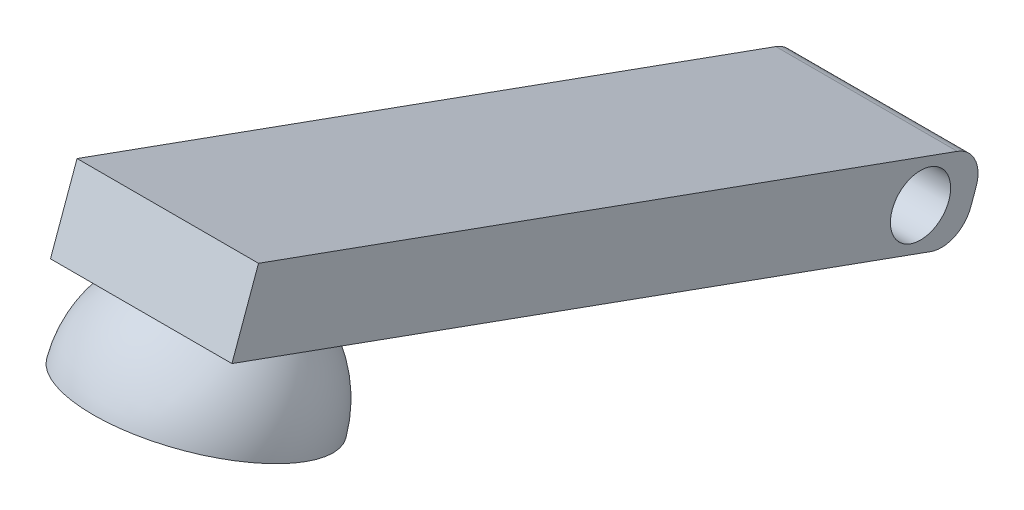
ISO-10303-21;
HEADER;
FILE_DESCRIPTION(('STEP AP214'),'2;1');
FILE_NAME('part.step','',(''),(''),'','','');
FILE_SCHEMA(('AUTOMOTIVE_DESIGN { 1 0 10303 214 1 1 1 1 }'));
ENDSEC;
DATA;
#1=APPLICATION_CONTEXT('core data for automotive mechanical design processes');
#2=APPLICATION_PROTOCOL_DEFINITION('international standard','automotive_design',2000,#1);
#3=PRODUCT_CONTEXT('',#1,'mechanical');
#4=PRODUCT('Part','Part','',(#3));
#5=PRODUCT_RELATED_PRODUCT_CATEGORY('part','',(#4));
#6=PRODUCT_DEFINITION_FORMATION('','',#4);
#7=PRODUCT_DEFINITION_CONTEXT('part definition',#1,'design');
#8=PRODUCT_DEFINITION('design','',#6,#7);
#9=PRODUCT_DEFINITION_SHAPE('','',#8);
#10=(LENGTH_UNIT() NAMED_UNIT(*) SI_UNIT(.MILLI.,.METRE.));
#11=(NAMED_UNIT(*) PLANE_ANGLE_UNIT() SI_UNIT($,.RADIAN.));
#12=(NAMED_UNIT(*) SI_UNIT($,.STERADIAN.) SOLID_ANGLE_UNIT());
#13=UNCERTAINTY_MEASURE_WITH_UNIT(LENGTH_MEASURE(1.E-05),#10,'distance_accuracy_value','');
#14=(GEOMETRIC_REPRESENTATION_CONTEXT(3) GLOBAL_UNCERTAINTY_ASSIGNED_CONTEXT((#13)) GLOBAL_UNIT_ASSIGNED_CONTEXT((#10,
#11,#12)) REPRESENTATION_CONTEXT('',''));
#15=CARTESIAN_POINT('',(0.,0.,0.));
#16=DIRECTION('',(0.,0.,1.));
#17=DIRECTION('',(1.,0.,0.));
#18=AXIS2_PLACEMENT_3D('',#15,#16,#17);
#19=CARTESIAN_POINT('',(-74.7211519900755,7.99266774800508,22.125696733824));
#20=DIRECTION('',(0.,-0.339750987389327,-0.940515426012767));
#21=DIRECTION('',(0.,0.940515426012767,-0.339750987389327));
#22=AXIS2_PLACEMENT_3D('',#19,#20,#21);
#23=PLANE('',#22);
#24=DIRECTION('',(0.,0.940515426012767,-0.339750987389327));
#25=VECTOR('',#24,1.);
#26=CARTESIAN_POINT('',(-7.366,7.99266774800508,22.125696733824));
#27=LINE('',#26,#25);
#28=CARTESIAN_POINT('',(-7.366,49.8389678302955,7.00917511352338));
#29=VERTEX_POINT('',#28);
#30=CARTESIAN_POINT('',(-7.366,55.8112407854766,4.85175634360115));
#31=VERTEX_POINT('',#30);
#32=EDGE_CURVE('E130',#29,#31,#27,.T.);
#33=ORIENTED_EDGE('',*,*,#32,.F.);
#34=DIRECTION('',(1.,0.,0.));
#35=VECTOR('',#34,1.);
#36=CARTESIAN_POINT('',(-74.7211519900755,49.8389678302955,7.00917511352338));
#37=LINE('',#36,#35);
#38=CARTESIAN_POINT('',(7.366,49.8389678302955,7.00917511352338));
#39=VERTEX_POINT('',#38);
#40=EDGE_CURVE('E100',#29,#39,#37,.T.);
#41=ORIENTED_EDGE('',*,*,#40,.T.);
#42=DIRECTION('',(0.,0.940515426012767,-0.339750987389327));
#43=VECTOR('',#42,1.);
#44=CARTESIAN_POINT('',(7.366,7.99266774800508,22.125696733824));
#45=LINE('',#44,#43);
#46=CARTESIAN_POINT('',(7.366,55.8112407854766,4.85175634360115));
#47=VERTEX_POINT('',#46);
#48=EDGE_CURVE('E104',#39,#47,#45,.T.);
#49=ORIENTED_EDGE('',*,*,#48,.T.);
#50=DIRECTION('',(1.,0.,0.));
#51=VECTOR('',#50,1.);
#52=CARTESIAN_POINT('',(-74.7211519900755,55.8112407854766,4.85175634360115));
#53=LINE('',#52,#51);
#54=EDGE_CURVE('E119',#31,#47,#53,.T.);
#55=ORIENTED_EDGE('',*,*,#54,.F.);
#56=EDGE_LOOP('',(#33,#41,#49,#55));
#57=FACE_BOUND('',#56,.T.);
#58=ADVANCED_FACE('F35',(#57),#23,.F.);
#59=CARTESIAN_POINT('',(-74.7211519900755,47.8185730374715,-17.2739403902229));
#60=DIRECTION('',(0.,-0.940515426012767,0.339750987389328));
#61=DIRECTION('',(0.,-0.339750987389328,-0.940515426012767));
#62=AXIS2_PLACEMENT_3D('',#59,#60,#61);
#63=PLANE('',#62);
#64=DIRECTION('',(0.,-0.339750987389328,-0.940515426012767));
#65=VECTOR('',#64,1.);
#66=CARTESIAN_POINT('',(7.366,47.8185730374715,-17.2739403902229));
#67=LINE('',#66,#65);
#68=CARTESIAN_POINT('',(7.366,35.3157624712154,-51.884836730619));
#69=VERTEX_POINT('',#68);
#70=EDGE_CURVE('E117',#47,#69,#67,.T.);
#71=ORIENTED_EDGE('',*,*,#70,.T.);
#72=DIRECTION('',(1.,0.,0.));
#73=VECTOR('',#72,1.);
#74=CARTESIAN_POINT('',(-74.7211519900755,35.3157624712154,-51.884836730619));
#75=LINE('',#74,#73);
#76=CARTESIAN_POINT('',(-7.366,35.3157624712154,-51.8848367306191));
#77=VERTEX_POINT('',#76);
#78=EDGE_CURVE('E11',#69,#77,#75,.F.);
#79=ORIENTED_EDGE('',*,*,#78,.T.);
#80=DIRECTION('',(0.,-0.339750987389328,-0.940515426012767));
#81=VECTOR('',#80,1.);
#82=CARTESIAN_POINT('',(-7.366,47.8185730374715,-17.2739403902229));
#83=LINE('',#82,#81);
#84=EDGE_CURVE('E128',#31,#77,#83,.T.);
#85=ORIENTED_EDGE('',*,*,#84,.F.);
#86=ORIENTED_EDGE('',*,*,#54,.T.);
#87=EDGE_LOOP('',(#71,#79,#85,#86));
#88=FACE_BOUND('',#87,.T.);
#89=ADVANCED_FACE('F171',(#88),#63,.F.);
#90=CARTESIAN_POINT('',(-74.7211519900755,-13.365778074225,-36.9998055224686));
#91=DIRECTION('',(0.,0.339750987389328,0.940515426012767));
#92=DIRECTION('',(0.,-0.940515426012767,0.339750987389328));
#93=AXIS2_PLACEMENT_3D('',#90,#91,#92);
#94=PLANE('',#93);
#95=DIRECTION('',(0.,-0.940515426012767,0.339750987389328));
#96=VECTOR('',#95,1.);
#97=CARTESIAN_POINT('',(7.366,-13.365778074225,-36.9998055224686));
#98=LINE('',#97,#96);
#99=CARTESIAN_POINT('',(7.366,32.0638857811741,-53.4107784047226));
#100=VERTEX_POINT('',#99);
#101=CARTESIAN_POINT('',(7.366,30.869431190138,-52.9792946507382));
#102=VERTEX_POINT('',#101);
#103=EDGE_CURVE('E115',#100,#102,#98,.T.);
#104=ORIENTED_EDGE('',*,*,#103,.T.);
#105=DIRECTION('',(1.,0.,0.));
#106=VECTOR('',#105,1.);
#107=CARTESIAN_POINT('',(-74.7211519900755,30.869431190138,-52.9792946507382));
#108=LINE('',#107,#106);
#109=CARTESIAN_POINT('',(-7.366,30.869431190138,-52.9792946507382));
#110=VERTEX_POINT('',#109);
#111=EDGE_CURVE('E56',#102,#110,#108,.F.);
#112=ORIENTED_EDGE('',*,*,#111,.T.);
#113=DIRECTION('',(0.,-0.940515426012767,0.339750987389328));
#114=VECTOR('',#113,1.);
#115=CARTESIAN_POINT('',(-7.366,-13.365778074225,-36.9998055224686));
#116=LINE('',#115,#114);
#117=CARTESIAN_POINT('',(-7.366,32.063885781174,-53.4107784047226));
#118=VERTEX_POINT('',#117);
#119=EDGE_CURVE('E125',#118,#110,#116,.T.);
#120=ORIENTED_EDGE('',*,*,#119,.F.);
#121=DIRECTION('',(1.,0.,0.));
#122=VECTOR('',#121,1.);
#123=CARTESIAN_POINT('',(-74.7211519900755,32.063885781174,-53.4107784047226));
#124=LINE('',#123,#122);
#125=EDGE_CURVE('E144',#118,#100,#124,.T.);
#126=ORIENTED_EDGE('',*,*,#125,.T.);
#127=EDGE_LOOP('',(#104,#112,#120,#126));
#128=FACE_BOUND('',#127,.T.);
#129=ADVANCED_FACE('F166',(#128),#94,.F.);
#130=CARTESIAN_POINT('',(-74.7211519900755,41.8463000822905,-15.1165216203006));
#131=DIRECTION('',(0.,0.940515426012768,-0.339750987389326));
#132=DIRECTION('',(0.,0.339750987389326,0.940515426012768));
#133=AXIS2_PLACEMENT_3D('',#130,#131,#132);
#134=PLANE('',#133);
#135=CARTESIAN_POINT('',(0.,47.4451827283613,0.382581230077784));
#136=DIRECTION('',(0.,0.940515426012768,-0.339750987389326));
#137=DIRECTION('',(0.,0.339750987389326,0.940515426012768));
#138=AXIS2_PLACEMENT_3D('',#135,#136,#137);
#139=CIRCLE('',#138,6.22170394666915);
#140=CARTESIAN_POINT('',(0.,49.5590127874862,6.23418976800463));
#141=VERTEX_POINT('',#140);
#142=EDGE_CURVE('E127',#141,#141,#139,.F.);
#143=ORIENTED_EDGE('',*,*,#142,.F.);
#144=EDGE_LOOP('',(#143));
#145=FACE_BOUND('',#144,.T.);
#146=DIRECTION('',(0.,0.339750987389326,0.940515426012768));
#147=VECTOR('',#146,1.);
#148=CARTESIAN_POINT('',(-7.366,41.8463000822905,-15.1165216203006));
#149=LINE('',#148,#147);
#150=CARTESIAN_POINT('',(-7.366,29.3434895160344,-49.7274179606969));
#151=VERTEX_POINT('',#150);
#152=EDGE_CURVE('E124',#151,#29,#149,.T.);
#153=ORIENTED_EDGE('',*,*,#152,.F.);
#154=DIRECTION('',(1.,0.,0.));
#155=VECTOR('',#154,1.);
#156=CARTESIAN_POINT('',(-74.7211519900755,29.3434895160344,-49.7274179606969));
#157=LINE('',#156,#155);
#158=CARTESIAN_POINT('',(7.366,29.3434895160344,-49.7274179606969));
#159=VERTEX_POINT('',#158);
#160=EDGE_CURVE('E137',#151,#159,#157,.T.);
#161=ORIENTED_EDGE('',*,*,#160,.T.);
#162=DIRECTION('',(0.,0.339750987389326,0.940515426012768));
#163=VECTOR('',#162,1.);
#164=CARTESIAN_POINT('',(7.366,41.8463000822905,-15.1165216203006));
#165=LINE('',#164,#163);
#166=EDGE_CURVE('E113',#159,#39,#165,.T.);
#167=ORIENTED_EDGE('',*,*,#166,.T.);
#168=ORIENTED_EDGE('',*,*,#40,.F.);
#169=EDGE_LOOP('',(#153,#161,#167,#168));
#170=FACE_BOUND('',#169,.T.);
#171=ADVANCED_FACE('F157',(#145,#170),#134,.F.);
#172=CARTESIAN_POINT('',(-74.7211519900755,33.02,-48.895));
#173=DIRECTION('',(1.,0.,0.));
#174=DIRECTION('',(0.,0.,-1.));
#175=AXIS2_PLACEMENT_3D('',#172,#173,#174);
#176=CYLINDRICAL_SURFACE('',#175,2.44475000000001);
#177=CARTESIAN_POINT('',(7.366,33.02,-48.895));
#178=DIRECTION('',(-1.,0.,0.));
#179=DIRECTION('',(0.,0.,1.));
#180=AXIS2_PLACEMENT_3D('',#177,#178,#179);
#181=CIRCLE('',#180,2.44475000000001);
#182=CARTESIAN_POINT('',(7.366,33.02,-46.45025));
#183=VERTEX_POINT('',#182);
#184=EDGE_CURVE('E109',#183,#183,#181,.F.);
#185=ORIENTED_EDGE('',*,*,#184,.T.);
#186=EDGE_LOOP('',(#185));
#187=FACE_BOUND('',#186,.T.);
#188=CARTESIAN_POINT('',(-7.366,33.02,-48.895));
#189=DIRECTION('',(-1.,0.,0.));
#190=DIRECTION('',(0.,0.,1.));
#191=AXIS2_PLACEMENT_3D('',#188,#189,#190);
#192=CIRCLE('',#191,2.44475000000001);
#193=CARTESIAN_POINT('',(-7.366,33.02,-46.45025));
#194=VERTEX_POINT('',#193);
#195=EDGE_CURVE('E112',#194,#194,#192,.F.);
#196=ORIENTED_EDGE('',*,*,#195,.F.);
#197=EDGE_LOOP('',(#196));
#198=FACE_BOUND('',#197,.T.);
#199=ADVANCED_FACE('F182',(#187,#198),#176,.F.);
#200=CARTESIAN_POINT('',(7.366,0.,0.));
#201=DIRECTION('',(-1.,0.,0.));
#202=DIRECTION('',(0.,0.,1.));
#203=AXIS2_PLACEMENT_3D('',#200,#201,#202);
#204=PLANE('',#203);
#205=ORIENTED_EDGE('',*,*,#166,.F.);
#206=CARTESIAN_POINT('',(7.366,31.7323986981068,-50.5903854686657));
#207=DIRECTION('',(-1.,0.,0.));
#208=DIRECTION('',(0.,0.,1.));
#209=AXIS2_PLACEMENT_3D('',#206,#207,#208);
#210=CIRCLE('',#209,2.54);
#211=EDGE_CURVE('E142',#159,#102,#210,.F.);
#212=ORIENTED_EDGE('',*,*,#211,.T.);
#213=ORIENTED_EDGE('',*,*,#103,.F.);
#214=CARTESIAN_POINT('',(7.366,32.9268532891429,-51.0218692226501));
#215=DIRECTION('',(-1.,0.,0.));
#216=DIRECTION('',(0.,0.,1.));
#217=AXIS2_PLACEMENT_3D('',#214,#215,#216);
#218=CIRCLE('',#217,2.54);
#219=EDGE_CURVE('E140',#100,#69,#218,.F.);
#220=ORIENTED_EDGE('',*,*,#219,.T.);
#221=ORIENTED_EDGE('',*,*,#70,.F.);
#222=ORIENTED_EDGE('',*,*,#48,.F.);
#223=EDGE_LOOP('',(#205,#212,#213,#220,#221,#222));
#224=FACE_BOUND('',#223,.T.);
#225=ORIENTED_EDGE('',*,*,#184,.F.);
#226=EDGE_LOOP('',(#225));
#227=FACE_BOUND('',#226,.T.);
#228=ADVANCED_FACE('F163',(#224,#227),#204,.F.);
#229=CARTESIAN_POINT('',(-7.366,25.4,-49.53));
#230=DIRECTION('',(-1.,0.,0.));
#231=DIRECTION('',(0.,0.,1.));
#232=AXIS2_PLACEMENT_3D('',#229,#230,#231);
#233=PLANE('',#232);
#234=ORIENTED_EDGE('',*,*,#195,.T.);
#235=EDGE_LOOP('',(#234));
#236=FACE_BOUND('',#235,.T.);
#237=ORIENTED_EDGE('',*,*,#119,.T.);
#238=CARTESIAN_POINT('',(-7.366,31.7323986981068,-50.5903854686657));
#239=DIRECTION('',(-1.,0.,0.));
#240=DIRECTION('',(0.,0.,1.));
#241=AXIS2_PLACEMENT_3D('',#238,#239,#240);
#242=CIRCLE('',#241,2.54);
#243=EDGE_CURVE('E43',#110,#151,#242,.T.);
#244=ORIENTED_EDGE('',*,*,#243,.T.);
#245=ORIENTED_EDGE('',*,*,#152,.T.);
#246=ORIENTED_EDGE('',*,*,#32,.T.);
#247=ORIENTED_EDGE('',*,*,#84,.T.);
#248=CARTESIAN_POINT('',(-7.366,32.9268532891429,-51.0218692226501));
#249=DIRECTION('',(-1.,0.,0.));
#250=DIRECTION('',(0.,0.,1.));
#251=AXIS2_PLACEMENT_3D('',#248,#249,#250);
#252=CIRCLE('',#251,2.54);
#253=EDGE_CURVE('E148',#77,#118,#252,.T.);
#254=ORIENTED_EDGE('',*,*,#253,.T.);
#255=EDGE_LOOP('',(#237,#244,#245,#246,#247,#254));
#256=FACE_BOUND('',#255,.T.);
#257=ADVANCED_FACE('F152',(#236,#256),#233,.T.);
#258=CARTESIAN_POINT('',(0.,41.4729097731802,2.54000000000001));
#259=DIRECTION('',(0.,-0.940515426012767,0.339750987389327));
#260=DIRECTION('',(0.,0.339750987389327,0.940515426012767));
#261=AXIS2_PLACEMENT_3D('',#258,#259,#260);
#262=SPHERICAL_SURFACE('',#261,8.88999999999992);
#263=CARTESIAN_POINT('',(0.,41.4729097731802,2.54000000000001));
#264=DIRECTION('',(0.,-0.940515426012767,0.339750987389327));
#265=DIRECTION('',(0.,-0.339750987389327,-0.940515426012767));
#266=AXIS2_PLACEMENT_3D('',#263,#264,#265);
#267=CIRCLE('',#266,8.88999999999992);
#268=CARTESIAN_POINT('',(0.,38.4525234952891,-5.82118213725342));
#269=VERTEX_POINT('',#268);
#270=EDGE_CURVE('E101',#269,#269,#267,.T.);
#271=ORIENTED_EDGE('',*,*,#270,.F.);
#272=EDGE_LOOP('',(#271));
#273=FACE_BOUND('',#272,.T.);
#274=ORIENTED_EDGE('',*,*,#142,.T.);
#275=EDGE_LOOP('',(#274));
#276=FACE_BOUND('',#275,.T.);
#277=ADVANCED_FACE('F94',(#273,#276),#262,.T.);
#278=CARTESIAN_POINT('',(0.,41.4729097731802,2.54000000000001));
#279=DIRECTION('',(0.,-0.940515426012767,0.339750987389327));
#280=DIRECTION('',(0.,-0.339750987389327,-0.940515426012767));
#281=AXIS2_PLACEMENT_3D('',#278,#279,#280);
#282=SPHERICAL_SURFACE('',#281,6.34999999999992);
#283=CARTESIAN_POINT('',(0.,47.4451827283612,0.382581230077813));
#284=VERTEX_POINT('',#283);
#285=VERTEX_LOOP('',#284);
#286=FACE_BOUND('',#285,.T.);
#287=CARTESIAN_POINT('',(0.,41.4729097731802,2.54000000000001));
#288=DIRECTION('',(0.,-0.940515426012767,0.339750987389327));
#289=DIRECTION('',(0.,-0.339750987389327,-0.940515426012767));
#290=AXIS2_PLACEMENT_3D('',#287,#288,#289);
#291=CIRCLE('',#290,6.34999999999992);
#292=CARTESIAN_POINT('',(0.,39.315491003258,-3.43227295518099));
#293=VERTEX_POINT('',#292);
#294=EDGE_CURVE('E98',#293,#293,#291,.T.);
#295=ORIENTED_EDGE('',*,*,#294,.T.);
#296=EDGE_LOOP('',(#295));
#297=FACE_BOUND('',#296,.T.);
#298=ADVANCED_FACE('F90',(#286,#297),#282,.F.);
#299=CARTESIAN_POINT('',(0.,38.4525234952891,-5.82118213725341));
#300=DIRECTION('',(0.,0.940515426012767,-0.339750987389327));
#301=DIRECTION('',(0.,0.339750987389327,0.940515426012767));
#302=AXIS2_PLACEMENT_3D('',#299,#300,#301);
#303=PLANE('',#302);
#304=ORIENTED_EDGE('',*,*,#294,.F.);
#305=EDGE_LOOP('',(#304));
#306=FACE_BOUND('',#305,.T.);
#307=ORIENTED_EDGE('',*,*,#270,.T.);
#308=EDGE_LOOP('',(#307));
#309=FACE_BOUND('',#308,.T.);
#310=ADVANCED_FACE('F93',(#306,#309),#303,.F.);
#311=CARTESIAN_POINT('',(-74.7211519900755,31.7323986981068,-50.5903854686657));
#312=DIRECTION('',(1.,0.,0.));
#313=DIRECTION('',(0.,0.,-1.));
#314=AXIS2_PLACEMENT_3D('',#311,#312,#313);
#315=CYLINDRICAL_SURFACE('',#314,2.54);
#316=ORIENTED_EDGE('',*,*,#243,.F.);
#317=ORIENTED_EDGE('',*,*,#111,.F.);
#318=ORIENTED_EDGE('',*,*,#211,.F.);
#319=ORIENTED_EDGE('',*,*,#160,.F.);
#320=EDGE_LOOP('',(#316,#317,#318,#319));
#321=FACE_BOUND('',#320,.T.);
#322=ADVANCED_FACE('F160',(#321),#315,.T.);
#323=CARTESIAN_POINT('',(-74.7211519900755,32.9268532891429,-51.0218692226501));
#324=DIRECTION('',(1.,0.,0.));
#325=DIRECTION('',(0.,0.,-1.));
#326=AXIS2_PLACEMENT_3D('',#323,#324,#325);
#327=CYLINDRICAL_SURFACE('',#326,2.54);
#328=ORIENTED_EDGE('',*,*,#253,.F.);
#329=ORIENTED_EDGE('',*,*,#78,.F.);
#330=ORIENTED_EDGE('',*,*,#219,.F.);
#331=ORIENTED_EDGE('',*,*,#125,.F.);
#332=EDGE_LOOP('',(#328,#329,#330,#331));
#333=FACE_BOUND('',#332,.T.);
#334=ADVANCED_FACE('F37',(#333),#327,.T.);
#335=CLOSED_SHELL('',(#58,#89,#129,#171,#199,#228,#257,#277,#298,#310,#322,#334));
#336=MANIFOLD_SOLID_BREP('B2',#335);
#337=ADVANCED_BREP_SHAPE_REPRESENTATION('',(#18,#336),#14);
#338=SHAPE_DEFINITION_REPRESENTATION(#9,#337);
ENDSEC;
END-ISO-10303-21;
